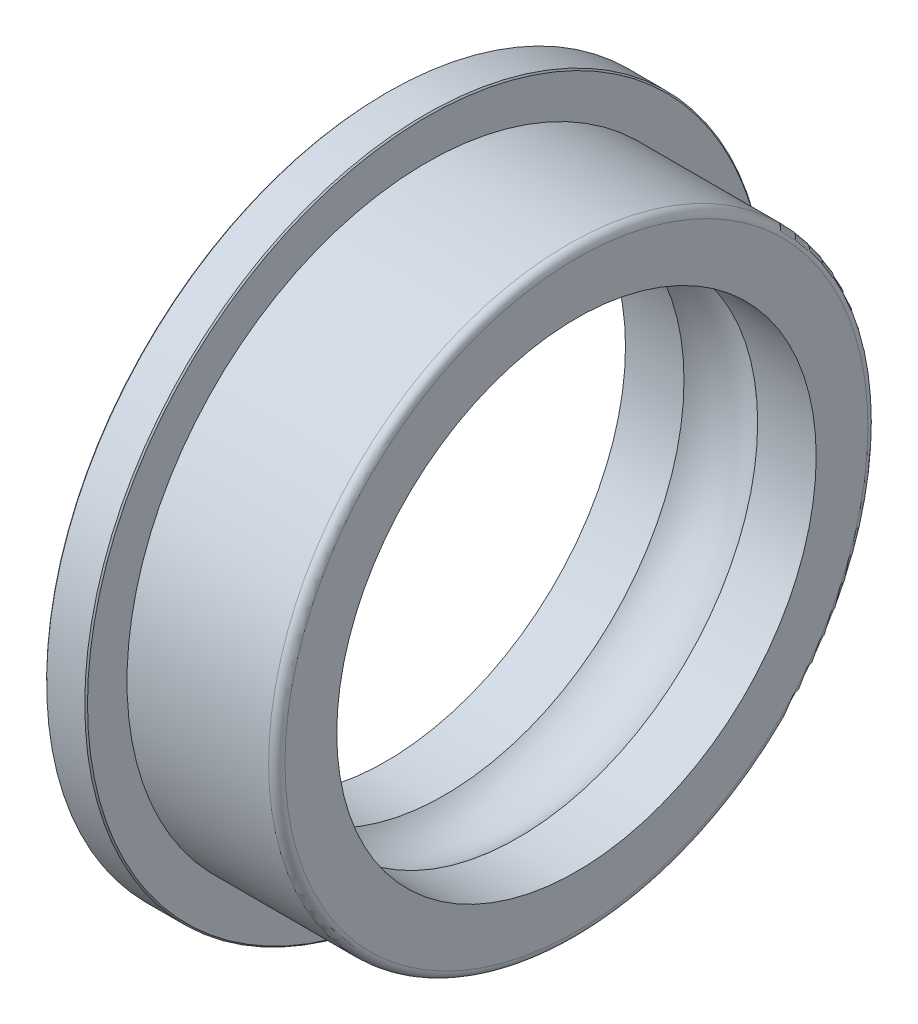
ISO-10303-21;
HEADER;
FILE_DESCRIPTION(('STEP AP214'),'2;1');
FILE_NAME('part.step','',(''),(''),'','','');
FILE_SCHEMA(('AUTOMOTIVE_DESIGN { 1 0 10303 214 1 1 1 1 }'));
ENDSEC;
DATA;
#1=APPLICATION_CONTEXT('core data for automotive mechanical design processes');
#2=APPLICATION_PROTOCOL_DEFINITION('international standard','automotive_design',2000,#1);
#3=PRODUCT_CONTEXT('',#1,'mechanical');
#4=PRODUCT('Part','Part','',(#3));
#5=PRODUCT_RELATED_PRODUCT_CATEGORY('part','',(#4));
#6=PRODUCT_DEFINITION_FORMATION('','',#4);
#7=PRODUCT_DEFINITION_CONTEXT('part definition',#1,'design');
#8=PRODUCT_DEFINITION('design','',#6,#7);
#9=PRODUCT_DEFINITION_SHAPE('','',#8);
#10=(LENGTH_UNIT() NAMED_UNIT(*) SI_UNIT(.MILLI.,.METRE.));
#11=(NAMED_UNIT(*) PLANE_ANGLE_UNIT() SI_UNIT($,.RADIAN.));
#12=(NAMED_UNIT(*) SI_UNIT($,.STERADIAN.) SOLID_ANGLE_UNIT());
#13=UNCERTAINTY_MEASURE_WITH_UNIT(LENGTH_MEASURE(1.E-05),#10,'distance_accuracy_value','');
#14=(GEOMETRIC_REPRESENTATION_CONTEXT(3) GLOBAL_UNCERTAINTY_ASSIGNED_CONTEXT((#13)) GLOBAL_UNIT_ASSIGNED_CONTEXT((#10,
#11,#12)) REPRESENTATION_CONTEXT('',''));
#15=CARTESIAN_POINT('',(0.,0.,0.));
#16=DIRECTION('',(0.,0.,1.));
#17=DIRECTION('',(1.,0.,0.));
#18=AXIS2_PLACEMENT_3D('',#15,#16,#17);
#19=CARTESIAN_POINT('',(-3.5,0.,0.));
#20=DIRECTION('',(1.,0.,0.));
#21=DIRECTION('',(0.,0.,-1.));
#22=AXIS2_PLACEMENT_3D('',#19,#20,#21);
#23=CYLINDRICAL_SURFACE('',#22,11.);
#24=CARTESIAN_POINT('',(3.2,0.,0.));
#25=DIRECTION('',(-1.,0.,0.));
#26=DIRECTION('',(0.,0.,1.));
#27=AXIS2_PLACEMENT_3D('',#24,#25,#26);
#28=CIRCLE('',#27,11.);
#29=CARTESIAN_POINT('',(3.2,0.,11.));
#30=VERTEX_POINT('',#29);
#31=EDGE_CURVE('E33',#30,#30,#28,.F.);
#32=ORIENTED_EDGE('',*,*,#31,.F.);
#33=EDGE_LOOP('',(#32));
#34=FACE_BOUND('',#33,.T.);
#35=CARTESIAN_POINT('',(-2.,0.,0.));
#36=DIRECTION('',(1.,0.,0.));
#37=DIRECTION('',(0.,0.,-1.));
#38=AXIS2_PLACEMENT_3D('',#35,#36,#37);
#39=CIRCLE('',#38,11.);
#40=CARTESIAN_POINT('',(-2.,0.,-11.));
#41=VERTEX_POINT('',#40);
#42=EDGE_CURVE('E17',#41,#41,#39,.T.);
#43=ORIENTED_EDGE('',*,*,#42,.T.);
#44=EDGE_LOOP('',(#43));
#45=FACE_BOUND('',#44,.T.);
#46=ADVANCED_FACE('F14',(#34,#45),#23,.T.);
#47=CARTESIAN_POINT('',(3.2,0.,0.));
#48=DIRECTION('',(-1.,0.,0.));
#49=DIRECTION('',(0.,0.,1.));
#50=AXIS2_PLACEMENT_3D('',#47,#48,#49);
#51=TOROIDAL_SURFACE('',#50,10.7,0.300000000000001);
#52=ORIENTED_EDGE('',*,*,#31,.T.);
#53=EDGE_LOOP('',(#52));
#54=FACE_BOUND('',#53,.T.);
#55=CARTESIAN_POINT('',(3.5,0.,0.));
#56=DIRECTION('',(-1.,0.,0.));
#57=DIRECTION('',(0.,0.,-1.));
#58=AXIS2_PLACEMENT_3D('',#55,#56,#57);
#59=CIRCLE('',#58,10.7);
#60=CARTESIAN_POINT('',(3.5,0.,-10.7));
#61=VERTEX_POINT('',#60);
#62=EDGE_CURVE('E43',#61,#61,#59,.T.);
#63=ORIENTED_EDGE('',*,*,#62,.T.);
#64=EDGE_LOOP('',(#63));
#65=FACE_BOUND('',#64,.T.);
#66=ADVANCED_FACE('F61',(#54,#65),#51,.T.);
#67=CARTESIAN_POINT('',(-2.,12.45,0.));
#68=DIRECTION('',(-1.,0.,0.));
#69=DIRECTION('',(0.,0.,1.));
#70=AXIS2_PLACEMENT_3D('',#67,#68,#69);
#71=PLANE('',#70);
#72=ORIENTED_EDGE('',*,*,#42,.F.);
#73=EDGE_LOOP('',(#72));
#74=FACE_BOUND('',#73,.T.);
#75=CARTESIAN_POINT('',(-2.,0.,0.));
#76=DIRECTION('',(-1.,0.,0.));
#77=DIRECTION('',(0.,0.,1.));
#78=AXIS2_PLACEMENT_3D('',#75,#76,#77);
#79=CIRCLE('',#78,12.45);
#80=CARTESIAN_POINT('',(-2.,0.,12.45));
#81=VERTEX_POINT('',#80);
#82=EDGE_CURVE('E40',#81,#81,#79,.T.);
#83=ORIENTED_EDGE('',*,*,#82,.F.);
#84=EDGE_LOOP('',(#83));
#85=FACE_BOUND('',#84,.T.);
#86=ADVANCED_FACE('F68',(#74,#85),#71,.F.);
#87=CARTESIAN_POINT('',(3.5,8.8,0.));
#88=DIRECTION('',(-1.,0.,0.));
#89=DIRECTION('',(0.,0.,1.));
#90=AXIS2_PLACEMENT_3D('',#87,#88,#89);
#91=PLANE('',#90);
#92=CARTESIAN_POINT('',(3.5,0.,0.));
#93=DIRECTION('',(1.,0.,0.));
#94=DIRECTION('',(0.,0.,-1.));
#95=AXIS2_PLACEMENT_3D('',#92,#93,#94);
#96=CIRCLE('',#95,8.8);
#97=CARTESIAN_POINT('',(3.5,0.,-8.8));
#98=VERTEX_POINT('',#97);
#99=EDGE_CURVE('E36',#98,#98,#96,.F.);
#100=ORIENTED_EDGE('',*,*,#99,.T.);
#101=EDGE_LOOP('',(#100));
#102=FACE_BOUND('',#101,.T.);
#103=ORIENTED_EDGE('',*,*,#62,.F.);
#104=EDGE_LOOP('',(#103));
#105=FACE_BOUND('',#104,.T.);
#106=ADVANCED_FACE('F110',(#102,#105),#91,.F.);
#107=CARTESIAN_POINT('',(-2.05,0.,0.));
#108=DIRECTION('',(-1.,0.,0.));
#109=DIRECTION('',(0.,0.,1.));
#110=AXIS2_PLACEMENT_3D('',#107,#108,#109);
#111=CONICAL_SURFACE('',#110,12.5,0.785398163397435);
#112=CARTESIAN_POINT('',(-2.05,0.,0.));
#113=DIRECTION('',(1.,0.,0.));
#114=DIRECTION('',(0.,0.,-1.));
#115=AXIS2_PLACEMENT_3D('',#112,#113,#114);
#116=CIRCLE('',#115,12.5);
#117=CARTESIAN_POINT('',(-2.05,0.,-12.5));
#118=VERTEX_POINT('',#117);
#119=EDGE_CURVE('E39',#118,#118,#116,.F.);
#120=ORIENTED_EDGE('',*,*,#119,.F.);
#121=EDGE_LOOP('',(#120));
#122=FACE_BOUND('',#121,.T.);
#123=ORIENTED_EDGE('',*,*,#82,.T.);
#124=EDGE_LOOP('',(#123));
#125=FACE_BOUND('',#124,.T.);
#126=ADVANCED_FACE('F120',(#122,#125),#111,.T.);
#127=CARTESIAN_POINT('',(-3.5,0.,0.));
#128=DIRECTION('',(1.,0.,0.));
#129=DIRECTION('',(0.,0.,-1.));
#130=AXIS2_PLACEMENT_3D('',#127,#128,#129);
#131=CYLINDRICAL_SURFACE('',#130,8.8);
#132=CARTESIAN_POINT('',(1.35221448002896,0.,0.));
#133=DIRECTION('',(-1.,0.,0.));
#134=DIRECTION('',(0.,0.,1.));
#135=AXIS2_PLACEMENT_3D('',#132,#133,#134);
#136=CIRCLE('',#135,8.8);
#137=CARTESIAN_POINT('',(1.35221448002896,0.,8.8));
#138=VERTEX_POINT('',#137);
#139=EDGE_CURVE('E94',#138,#138,#136,.T.);
#140=ORIENTED_EDGE('',*,*,#139,.T.);
#141=EDGE_LOOP('',(#140));
#142=FACE_BOUND('',#141,.T.);
#143=ORIENTED_EDGE('',*,*,#99,.F.);
#144=EDGE_LOOP('',(#143));
#145=FACE_BOUND('',#144,.T.);
#146=ADVANCED_FACE('F149',(#142,#145),#131,.F.);
#147=CARTESIAN_POINT('',(-3.78660254308519,0.,0.));
#148=DIRECTION('',(1.,0.,0.));
#149=DIRECTION('',(0.,0.,-1.));
#150=AXIS2_PLACEMENT_3D('',#147,#148,#149);
#151=CYLINDRICAL_SURFACE('',#150,12.5);
#152=CARTESIAN_POINT('',(-3.45,0.,0.));
#153=DIRECTION('',(1.,0.,0.));
#154=DIRECTION('',(0.,0.,-1.));
#155=AXIS2_PLACEMENT_3D('',#152,#153,#154);
#156=CIRCLE('',#155,12.5);
#157=CARTESIAN_POINT('',(-3.45,0.,-12.5));
#158=VERTEX_POINT('',#157);
#159=EDGE_CURVE('E97',#158,#158,#156,.F.);
#160=ORIENTED_EDGE('',*,*,#159,.F.);
#161=EDGE_LOOP('',(#160));
#162=FACE_BOUND('',#161,.T.);
#163=ORIENTED_EDGE('',*,*,#119,.T.);
#164=EDGE_LOOP('',(#163));
#165=FACE_BOUND('',#164,.T.);
#166=ADVANCED_FACE('F88',(#162,#165),#151,.T.);
#167=CARTESIAN_POINT('',(0.,0.,0.));
#168=DIRECTION('',(-1.,0.,0.));
#169=DIRECTION('',(0.,0.,1.));
#170=AXIS2_PLACEMENT_3D('',#167,#168,#169);
#171=TOROIDAL_SURFACE('',#170,7.3475,1.9845);
#172=CARTESIAN_POINT('',(-1.35221448002896,0.,0.));
#173=DIRECTION('',(1.,0.,0.));
#174=DIRECTION('',(0.,0.,-1.));
#175=AXIS2_PLACEMENT_3D('',#172,#173,#174);
#176=CIRCLE('',#175,8.8);
#177=CARTESIAN_POINT('',(-1.35221448002896,0.,-8.8));
#178=VERTEX_POINT('',#177);
#179=EDGE_CURVE('E30',#178,#178,#176,.F.);
#180=ORIENTED_EDGE('',*,*,#179,.T.);
#181=EDGE_LOOP('',(#180));
#182=FACE_BOUND('',#181,.T.);
#183=ORIENTED_EDGE('',*,*,#139,.F.);
#184=EDGE_LOOP('',(#183));
#185=FACE_BOUND('',#184,.T.);
#186=ADVANCED_FACE('F83',(#182,#185),#171,.F.);
#187=CARTESIAN_POINT('',(-3.45,0.,0.));
#188=DIRECTION('',(1.,0.,0.));
#189=DIRECTION('',(0.,1.,0.));
#190=AXIS2_PLACEMENT_3D('',#187,#188,#189);
#191=CONICAL_SURFACE('',#190,12.5,0.785398163397444);
#192=ORIENTED_EDGE('',*,*,#159,.T.);
#193=EDGE_LOOP('',(#192));
#194=FACE_BOUND('',#193,.T.);
#195=CARTESIAN_POINT('',(-3.5,0.,0.));
#196=DIRECTION('',(1.,0.,0.));
#197=DIRECTION('',(0.,1.,0.));
#198=AXIS2_PLACEMENT_3D('',#195,#196,#197);
#199=CIRCLE('',#198,12.45);
#200=CARTESIAN_POINT('',(-3.5,12.45,0.));
#201=VERTEX_POINT('',#200);
#202=EDGE_CURVE('E22',#201,#201,#199,.T.);
#203=ORIENTED_EDGE('',*,*,#202,.T.);
#204=EDGE_LOOP('',(#203));
#205=FACE_BOUND('',#204,.T.);
#206=ADVANCED_FACE('F77',(#194,#205),#191,.T.);
#207=CARTESIAN_POINT('',(-3.5,0.,0.));
#208=DIRECTION('',(1.,0.,0.));
#209=DIRECTION('',(0.,0.,-1.));
#210=AXIS2_PLACEMENT_3D('',#207,#208,#209);
#211=CYLINDRICAL_SURFACE('',#210,8.8);
#212=CARTESIAN_POINT('',(-3.5,0.,0.));
#213=DIRECTION('',(1.,0.,0.));
#214=DIRECTION('',(0.,0.,-1.));
#215=AXIS2_PLACEMENT_3D('',#212,#213,#214);
#216=CIRCLE('',#215,8.8);
#217=CARTESIAN_POINT('',(-3.5,0.,-8.8));
#218=VERTEX_POINT('',#217);
#219=EDGE_CURVE('E10',#218,#218,#216,.F.);
#220=ORIENTED_EDGE('',*,*,#219,.T.);
#221=EDGE_LOOP('',(#220));
#222=FACE_BOUND('',#221,.T.);
#223=ORIENTED_EDGE('',*,*,#179,.F.);
#224=EDGE_LOOP('',(#223));
#225=FACE_BOUND('',#224,.T.);
#226=ADVANCED_FACE('F71',(#222,#225),#211,.F.);
#227=CARTESIAN_POINT('',(-3.5,8.8,0.));
#228=DIRECTION('',(1.,0.,0.));
#229=DIRECTION('',(0.,0.,-1.));
#230=AXIS2_PLACEMENT_3D('',#227,#228,#229);
#231=PLANE('',#230);
#232=ORIENTED_EDGE('',*,*,#219,.F.);
#233=EDGE_LOOP('',(#232));
#234=FACE_BOUND('',#233,.T.);
#235=ORIENTED_EDGE('',*,*,#202,.F.);
#236=EDGE_LOOP('',(#235));
#237=FACE_BOUND('',#236,.T.);
#238=ADVANCED_FACE('F69',(#234,#237),#231,.F.);
#239=CLOSED_SHELL('',(#46,#66,#86,#106,#126,#146,#166,#186,#206,#226,#238));
#240=MANIFOLD_SOLID_BREP('B1',#239);
#241=ADVANCED_BREP_SHAPE_REPRESENTATION('',(#18,#240),#14);
#242=SHAPE_DEFINITION_REPRESENTATION(#9,#241);
ENDSEC;
END-ISO-10303-21;
